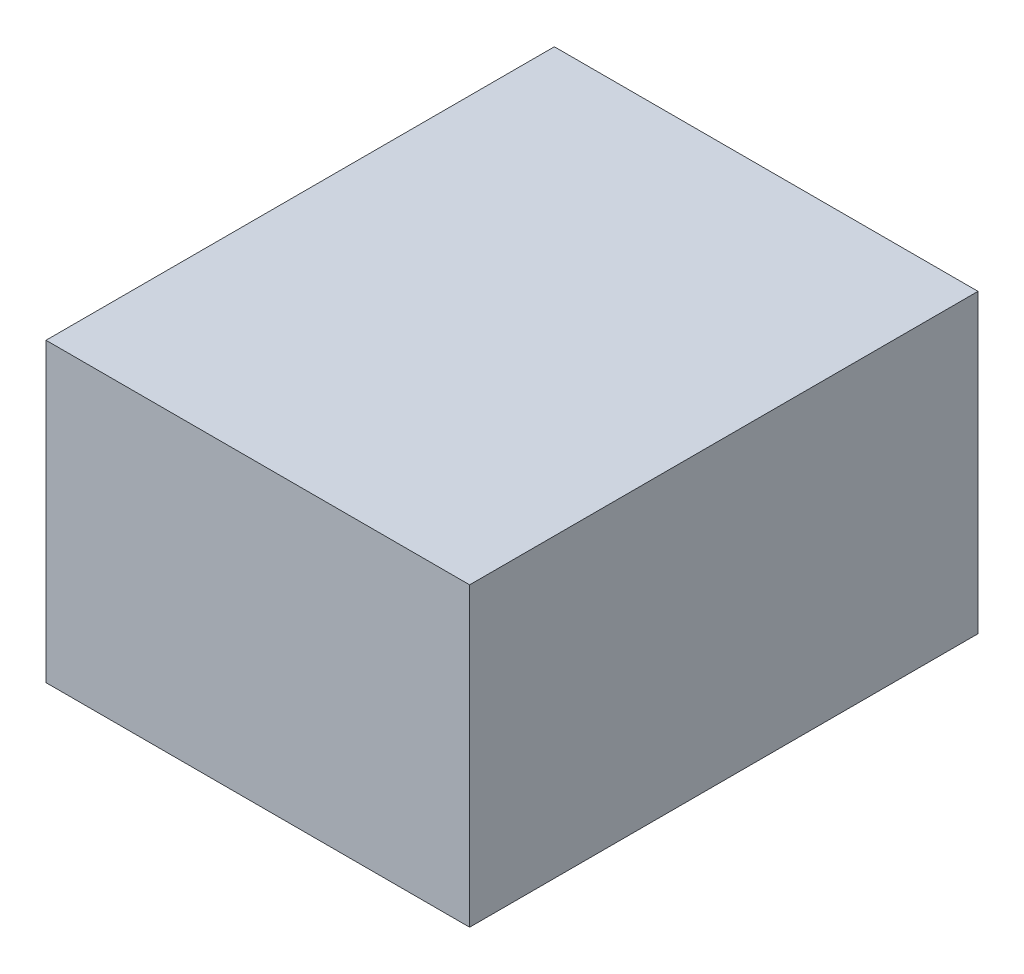
ISO-10303-21;
HEADER;
FILE_DESCRIPTION(('STEP AP214'),'2;1');
FILE_NAME('part.step','',(''),(''),'','','');
FILE_SCHEMA(('AUTOMOTIVE_DESIGN { 1 0 10303 214 1 1 1 1 }'));
ENDSEC;
DATA;
#1=APPLICATION_CONTEXT('core data for automotive mechanical design processes');
#2=APPLICATION_PROTOCOL_DEFINITION('international standard','automotive_design',2000,#1);
#3=PRODUCT_CONTEXT('',#1,'mechanical');
#4=PRODUCT('Part','Part','',(#3));
#5=PRODUCT_RELATED_PRODUCT_CATEGORY('part','',(#4));
#6=PRODUCT_DEFINITION_FORMATION('','',#4);
#7=PRODUCT_DEFINITION_CONTEXT('part definition',#1,'design');
#8=PRODUCT_DEFINITION('design','',#6,#7);
#9=PRODUCT_DEFINITION_SHAPE('','',#8);
#10=(LENGTH_UNIT() NAMED_UNIT(*) SI_UNIT(.MILLI.,.METRE.));
#11=(NAMED_UNIT(*) PLANE_ANGLE_UNIT() SI_UNIT($,.RADIAN.));
#12=(NAMED_UNIT(*) SI_UNIT($,.STERADIAN.) SOLID_ANGLE_UNIT());
#13=UNCERTAINTY_MEASURE_WITH_UNIT(LENGTH_MEASURE(1.E-05),#10,'distance_accuracy_value','');
#14=(GEOMETRIC_REPRESENTATION_CONTEXT(3) GLOBAL_UNCERTAINTY_ASSIGNED_CONTEXT((#13)) GLOBAL_UNIT_ASSIGNED_CONTEXT((#10,
#11,#12)) REPRESENTATION_CONTEXT('',''));
#15=CARTESIAN_POINT('',(0.,0.,0.));
#16=DIRECTION('',(0.,0.,1.));
#17=DIRECTION('',(1.,0.,0.));
#18=AXIS2_PLACEMENT_3D('',#15,#16,#17);
#19=CARTESIAN_POINT('',(0.,22.225,0.));
#20=DIRECTION('',(1.,0.,0.));
#21=DIRECTION('',(0.,0.,-1.));
#22=AXIS2_PLACEMENT_3D('',#19,#20,#21);
#23=PLANE('',#22);
#24=DIRECTION('',(0.,0.,1.));
#25=VECTOR('',#24,1.);
#26=CARTESIAN_POINT('',(0.,0.,0.));
#27=LINE('',#26,#25);
#28=CARTESIAN_POINT('',(0.,0.,-38.1));
#29=VERTEX_POINT('',#28);
#30=CARTESIAN_POINT('',(0.,0.,0.));
#31=VERTEX_POINT('',#30);
#32=EDGE_CURVE('E97',#29,#31,#27,.T.);
#33=ORIENTED_EDGE('',*,*,#32,.T.);
#34=DIRECTION('',(0.,-1.,0.));
#35=VECTOR('',#34,1.);
#36=CARTESIAN_POINT('',(0.,22.225,0.));
#37=LINE('',#36,#35);
#38=CARTESIAN_POINT('',(0.,22.225,0.));
#39=VERTEX_POINT('',#38);
#40=EDGE_CURVE('E11',#39,#31,#37,.T.);
#41=ORIENTED_EDGE('',*,*,#40,.F.);
#42=DIRECTION('',(0.,0.,1.));
#43=VECTOR('',#42,1.);
#44=CARTESIAN_POINT('',(0.,22.225,0.));
#45=LINE('',#44,#43);
#46=CARTESIAN_POINT('',(0.,22.225,-38.1));
#47=VERTEX_POINT('',#46);
#48=EDGE_CURVE('E85',#47,#39,#45,.T.);
#49=ORIENTED_EDGE('',*,*,#48,.F.);
#50=DIRECTION('',(0.,-1.,0.));
#51=VECTOR('',#50,1.);
#52=CARTESIAN_POINT('',(0.,22.225,-38.1));
#53=LINE('',#52,#51);
#54=EDGE_CURVE('E93',#47,#29,#53,.T.);
#55=ORIENTED_EDGE('',*,*,#54,.T.);
#56=EDGE_LOOP('',(#33,#41,#49,#55));
#57=FACE_BOUND('',#56,.T.);
#58=ADVANCED_FACE('F34',(#57),#23,.F.);
#59=CARTESIAN_POINT('',(0.,22.225,0.));
#60=DIRECTION('',(0.,0.,-1.));
#61=DIRECTION('',(-1.,0.,0.));
#62=AXIS2_PLACEMENT_3D('',#59,#60,#61);
#63=PLANE('',#62);
#64=DIRECTION('',(1.,0.,0.));
#65=VECTOR('',#64,1.);
#66=CARTESIAN_POINT('',(0.,0.,0.));
#67=LINE('',#66,#65);
#68=CARTESIAN_POINT('',(31.75,0.,0.));
#69=VERTEX_POINT('',#68);
#70=EDGE_CURVE('E89',#31,#69,#67,.T.);
#71=ORIENTED_EDGE('',*,*,#70,.T.);
#72=DIRECTION('',(0.,-1.,0.));
#73=VECTOR('',#72,1.);
#74=CARTESIAN_POINT('',(31.75,22.225,0.));
#75=LINE('',#74,#73);
#76=CARTESIAN_POINT('',(31.75,22.225,0.));
#77=VERTEX_POINT('',#76);
#78=EDGE_CURVE('E42',#77,#69,#75,.T.);
#79=ORIENTED_EDGE('',*,*,#78,.F.);
#80=DIRECTION('',(1.,0.,0.));
#81=VECTOR('',#80,1.);
#82=CARTESIAN_POINT('',(0.,22.225,0.));
#83=LINE('',#82,#81);
#84=EDGE_CURVE('E80',#39,#77,#83,.T.);
#85=ORIENTED_EDGE('',*,*,#84,.F.);
#86=ORIENTED_EDGE('',*,*,#40,.T.);
#87=EDGE_LOOP('',(#71,#79,#85,#86));
#88=FACE_BOUND('',#87,.T.);
#89=ADVANCED_FACE('F88',(#88),#63,.F.);
#90=CARTESIAN_POINT('',(31.75,22.225,0.));
#91=DIRECTION('',(-1.,0.,0.));
#92=DIRECTION('',(0.,0.,1.));
#93=AXIS2_PLACEMENT_3D('',#90,#91,#92);
#94=PLANE('',#93);
#95=DIRECTION('',(0.,0.,-1.));
#96=VECTOR('',#95,1.);
#97=CARTESIAN_POINT('',(31.75,0.,0.));
#98=LINE('',#97,#96);
#99=CARTESIAN_POINT('',(31.75,0.,-38.1));
#100=VERTEX_POINT('',#99);
#101=EDGE_CURVE('E67',#69,#100,#98,.T.);
#102=ORIENTED_EDGE('',*,*,#101,.T.);
#103=DIRECTION('',(0.,-1.,0.));
#104=VECTOR('',#103,1.);
#105=CARTESIAN_POINT('',(31.75,22.225,-38.1));
#106=LINE('',#105,#104);
#107=CARTESIAN_POINT('',(31.75,22.225,-38.1));
#108=VERTEX_POINT('',#107);
#109=EDGE_CURVE('E90',#108,#100,#106,.T.);
#110=ORIENTED_EDGE('',*,*,#109,.F.);
#111=DIRECTION('',(0.,0.,-1.));
#112=VECTOR('',#111,1.);
#113=CARTESIAN_POINT('',(31.75,22.225,0.));
#114=LINE('',#113,#112);
#115=EDGE_CURVE('E83',#77,#108,#114,.T.);
#116=ORIENTED_EDGE('',*,*,#115,.F.);
#117=ORIENTED_EDGE('',*,*,#78,.T.);
#118=EDGE_LOOP('',(#102,#110,#116,#117));
#119=FACE_BOUND('',#118,.T.);
#120=ADVANCED_FACE('F91',(#119),#94,.F.);
#121=CARTESIAN_POINT('',(0.,22.225,-38.1));
#122=DIRECTION('',(0.,0.,1.));
#123=DIRECTION('',(1.,0.,0.));
#124=AXIS2_PLACEMENT_3D('',#121,#122,#123);
#125=PLANE('',#124);
#126=DIRECTION('',(-1.,0.,0.));
#127=VECTOR('',#126,1.);
#128=CARTESIAN_POINT('',(0.,0.,-38.1));
#129=LINE('',#128,#127);
#130=EDGE_CURVE('E73',#100,#29,#129,.T.);
#131=ORIENTED_EDGE('',*,*,#130,.T.);
#132=ORIENTED_EDGE('',*,*,#54,.F.);
#133=DIRECTION('',(-1.,0.,0.));
#134=VECTOR('',#133,1.);
#135=CARTESIAN_POINT('',(0.,22.225,-38.1));
#136=LINE('',#135,#134);
#137=EDGE_CURVE('E50',#108,#47,#136,.T.);
#138=ORIENTED_EDGE('',*,*,#137,.F.);
#139=ORIENTED_EDGE('',*,*,#109,.T.);
#140=EDGE_LOOP('',(#131,#132,#138,#139));
#141=FACE_BOUND('',#140,.T.);
#142=ADVANCED_FACE('F104',(#141),#125,.F.);
#143=CARTESIAN_POINT('',(0.,22.225,0.));
#144=DIRECTION('',(0.,-1.,0.));
#145=DIRECTION('',(0.,0.,-1.));
#146=AXIS2_PLACEMENT_3D('',#143,#144,#145);
#147=PLANE('',#146);
#148=ORIENTED_EDGE('',*,*,#48,.T.);
#149=ORIENTED_EDGE('',*,*,#84,.T.);
#150=ORIENTED_EDGE('',*,*,#115,.T.);
#151=ORIENTED_EDGE('',*,*,#137,.T.);
#152=EDGE_LOOP('',(#148,#149,#150,#151));
#153=FACE_BOUND('',#152,.T.);
#154=ADVANCED_FACE('F81',(#153),#147,.F.);
#155=CARTESIAN_POINT('',(0.,0.,0.));
#156=DIRECTION('',(0.,-1.,0.));
#157=DIRECTION('',(0.,0.,-1.));
#158=AXIS2_PLACEMENT_3D('',#155,#156,#157);
#159=PLANE('',#158);
#160=ORIENTED_EDGE('',*,*,#32,.F.);
#161=ORIENTED_EDGE('',*,*,#130,.F.);
#162=ORIENTED_EDGE('',*,*,#101,.F.);
#163=ORIENTED_EDGE('',*,*,#70,.F.);
#164=EDGE_LOOP('',(#160,#161,#162,#163));
#165=FACE_BOUND('',#164,.T.);
#166=ADVANCED_FACE('F107',(#165),#159,.T.);
#167=CLOSED_SHELL('',(#58,#89,#120,#142,#154,#166));
#168=MANIFOLD_SOLID_BREP('B2',#167);
#169=ADVANCED_BREP_SHAPE_REPRESENTATION('',(#18,#168),#14);
#170=SHAPE_DEFINITION_REPRESENTATION(#9,#169);
ENDSEC;
END-ISO-10303-21;
